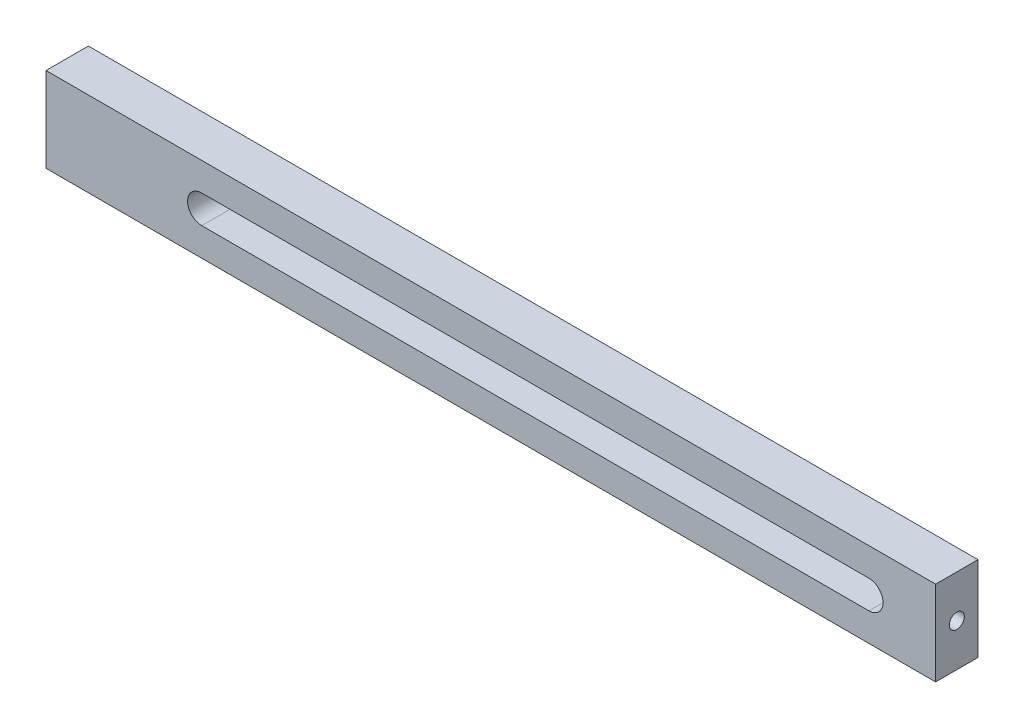
ISO-10303-21;
HEADER;
FILE_DESCRIPTION(('STEP AP214'),'2;1');
FILE_NAME('part.step','',(''),(''),'','','');
FILE_SCHEMA(('AUTOMOTIVE_DESIGN { 1 0 10303 214 1 1 1 1 }'));
ENDSEC;
DATA;
#1=APPLICATION_CONTEXT('core data for automotive mechanical design processes');
#2=APPLICATION_PROTOCOL_DEFINITION('international standard','automotive_design',2000,#1);
#3=PRODUCT_CONTEXT('',#1,'mechanical');
#4=PRODUCT('Part','Part','',(#3));
#5=PRODUCT_RELATED_PRODUCT_CATEGORY('part','',(#4));
#6=PRODUCT_DEFINITION_FORMATION('','',#4);
#7=PRODUCT_DEFINITION_CONTEXT('part definition',#1,'design');
#8=PRODUCT_DEFINITION('design','',#6,#7);
#9=PRODUCT_DEFINITION_SHAPE('','',#8);
#10=(LENGTH_UNIT() NAMED_UNIT(*) SI_UNIT(.MILLI.,.METRE.));
#11=(NAMED_UNIT(*) PLANE_ANGLE_UNIT() SI_UNIT($,.RADIAN.));
#12=(NAMED_UNIT(*) SI_UNIT($,.STERADIAN.) SOLID_ANGLE_UNIT());
#13=UNCERTAINTY_MEASURE_WITH_UNIT(LENGTH_MEASURE(1.E-05),#10,'distance_accuracy_value','');
#14=(GEOMETRIC_REPRESENTATION_CONTEXT(3) GLOBAL_UNCERTAINTY_ASSIGNED_CONTEXT((#13)) GLOBAL_UNIT_ASSIGNED_CONTEXT((#10,
#11,#12)) REPRESENTATION_CONTEXT('',''));
#15=CARTESIAN_POINT('',(0.,0.,0.));
#16=DIRECTION('',(0.,0.,1.));
#17=DIRECTION('',(1.,0.,0.));
#18=AXIS2_PLACEMENT_3D('',#15,#16,#17);
#19=CARTESIAN_POINT('',(0.,0.,9.525));
#20=DIRECTION('',(0.,0.,-1.));
#21=DIRECTION('',(-1.,0.,0.));
#22=AXIS2_PLACEMENT_3D('',#19,#20,#21);
#23=PLANE('',#22);
#24=DIRECTION('',(0.,1.,0.));
#25=VECTOR('',#24,1.);
#26=CARTESIAN_POINT('',(200.,-19.05,9.525));
#27=LINE('',#26,#25);
#28=CARTESIAN_POINT('',(200.,-19.05,9.525));
#29=VERTEX_POINT('',#28);
#30=CARTESIAN_POINT('',(200.,19.05,9.525));
#31=VERTEX_POINT('',#30);
#32=EDGE_CURVE('E205',#29,#31,#27,.T.);
#33=ORIENTED_EDGE('',*,*,#32,.T.);
#34=DIRECTION('',(-1.,0.,0.));
#35=VECTOR('',#34,1.);
#36=CARTESIAN_POINT('',(-200.,19.05,9.525));
#37=LINE('',#36,#35);
#38=CARTESIAN_POINT('',(-200.,19.05,9.525));
#39=VERTEX_POINT('',#38);
#40=EDGE_CURVE('E217',#31,#39,#37,.T.);
#41=ORIENTED_EDGE('',*,*,#40,.T.);
#42=DIRECTION('',(0.,-1.,0.));
#43=VECTOR('',#42,1.);
#44=CARTESIAN_POINT('',(-200.,-19.05,9.525));
#45=LINE('',#44,#43);
#46=CARTESIAN_POINT('',(-200.,-19.05,9.525));
#47=VERTEX_POINT('',#46);
#48=EDGE_CURVE('E199',#39,#47,#45,.T.);
#49=ORIENTED_EDGE('',*,*,#48,.T.);
#50=DIRECTION('',(1.,0.,0.));
#51=VECTOR('',#50,1.);
#52=CARTESIAN_POINT('',(-200.,-19.05,9.525));
#53=LINE('',#52,#51);
#54=EDGE_CURVE('E212',#47,#29,#53,.T.);
#55=ORIENTED_EDGE('',*,*,#54,.T.);
#56=EDGE_LOOP('',(#33,#41,#49,#55));
#57=FACE_BOUND('',#56,.T.);
#58=CARTESIAN_POINT('',(-130.,0.,9.525));
#59=DIRECTION('',(0.,0.,1.));
#60=DIRECTION('',(1.,0.,0.));
#61=AXIS2_PLACEMENT_3D('',#58,#59,#60);
#62=CIRCLE('',#61,6.35);
#63=CARTESIAN_POINT('',(-130.,6.35,9.525));
#64=VERTEX_POINT('',#63);
#65=CARTESIAN_POINT('',(-130.,-6.35,9.525));
#66=VERTEX_POINT('',#65);
#67=EDGE_CURVE('E135',#64,#66,#62,.T.);
#68=ORIENTED_EDGE('',*,*,#67,.F.);
#69=DIRECTION('',(-1.,0.,0.));
#70=VECTOR('',#69,1.);
#71=CARTESIAN_POINT('',(-130.,6.35,9.525));
#72=LINE('',#71,#70);
#73=CARTESIAN_POINT('',(170.,6.35,9.525));
#74=VERTEX_POINT('',#73);
#75=EDGE_CURVE('E231',#74,#64,#72,.T.);
#76=ORIENTED_EDGE('',*,*,#75,.F.);
#77=CARTESIAN_POINT('',(170.,0.,9.525));
#78=DIRECTION('',(0.,0.,1.));
#79=DIRECTION('',(1.,0.,0.));
#80=AXIS2_PLACEMENT_3D('',#77,#78,#79);
#81=CIRCLE('',#80,6.35);
#82=CARTESIAN_POINT('',(170.,-6.35,9.525));
#83=VERTEX_POINT('',#82);
#84=EDGE_CURVE('E243',#83,#74,#81,.T.);
#85=ORIENTED_EDGE('',*,*,#84,.F.);
#86=DIRECTION('',(1.,0.,0.));
#87=VECTOR('',#86,1.);
#88=CARTESIAN_POINT('',(-130.,-6.35,9.525));
#89=LINE('',#88,#87);
#90=EDGE_CURVE('E244',#66,#83,#89,.T.);
#91=ORIENTED_EDGE('',*,*,#90,.F.);
#92=EDGE_LOOP('',(#68,#76,#85,#91));
#93=FACE_BOUND('',#92,.T.);
#94=ADVANCED_FACE('F33',(#57,#93),#23,.F.);
#95=CARTESIAN_POINT('',(0.,0.,-9.525));
#96=DIRECTION('',(0.,0.,-1.));
#97=DIRECTION('',(-1.,0.,0.));
#98=AXIS2_PLACEMENT_3D('',#95,#96,#97);
#99=PLANE('',#98);
#100=DIRECTION('',(0.,1.,0.));
#101=VECTOR('',#100,1.);
#102=CARTESIAN_POINT('',(200.,-19.05,-9.525));
#103=LINE('',#102,#101);
#104=CARTESIAN_POINT('',(200.,-19.05,-9.525));
#105=VERTEX_POINT('',#104);
#106=CARTESIAN_POINT('',(200.,19.05,-9.525));
#107=VERTEX_POINT('',#106);
#108=EDGE_CURVE('E194',#105,#107,#103,.T.);
#109=ORIENTED_EDGE('',*,*,#108,.F.);
#110=DIRECTION('',(1.,0.,0.));
#111=VECTOR('',#110,1.);
#112=CARTESIAN_POINT('',(-200.,-19.05,-9.525));
#113=LINE('',#112,#111);
#114=CARTESIAN_POINT('',(-200.,-19.05,-9.525));
#115=VERTEX_POINT('',#114);
#116=EDGE_CURVE('E203',#115,#105,#113,.T.);
#117=ORIENTED_EDGE('',*,*,#116,.F.);
#118=DIRECTION('',(0.,-1.,0.));
#119=VECTOR('',#118,1.);
#120=CARTESIAN_POINT('',(-200.,-19.05,-9.525));
#121=LINE('',#120,#119);
#122=CARTESIAN_POINT('',(-200.,19.05,-9.525));
#123=VERTEX_POINT('',#122);
#124=EDGE_CURVE('E193',#123,#115,#121,.T.);
#125=ORIENTED_EDGE('',*,*,#124,.F.);
#126=DIRECTION('',(-1.,0.,0.));
#127=VECTOR('',#126,1.);
#128=CARTESIAN_POINT('',(-200.,19.05,-9.525));
#129=LINE('',#128,#127);
#130=EDGE_CURVE('E186',#107,#123,#129,.T.);
#131=ORIENTED_EDGE('',*,*,#130,.F.);
#132=EDGE_LOOP('',(#109,#117,#125,#131));
#133=FACE_BOUND('',#132,.T.);
#134=DIRECTION('',(-1.,0.,0.));
#135=VECTOR('',#134,1.);
#136=CARTESIAN_POINT('',(-130.,6.35,-9.525));
#137=LINE('',#136,#135);
#138=CARTESIAN_POINT('',(170.,6.35,-9.525));
#139=VERTEX_POINT('',#138);
#140=CARTESIAN_POINT('',(-130.,6.35,-9.525));
#141=VERTEX_POINT('',#140);
#142=EDGE_CURVE('E232',#139,#141,#137,.T.);
#143=ORIENTED_EDGE('',*,*,#142,.T.);
#144=CARTESIAN_POINT('',(-130.,0.,-9.525));
#145=DIRECTION('',(0.,0.,1.));
#146=DIRECTION('',(1.,0.,0.));
#147=AXIS2_PLACEMENT_3D('',#144,#145,#146);
#148=CIRCLE('',#147,6.35);
#149=CARTESIAN_POINT('',(-130.,-6.35,-9.525));
#150=VERTEX_POINT('',#149);
#151=EDGE_CURVE('E56',#141,#150,#148,.T.);
#152=ORIENTED_EDGE('',*,*,#151,.T.);
#153=DIRECTION('',(1.,0.,0.));
#154=VECTOR('',#153,1.);
#155=CARTESIAN_POINT('',(-130.,-6.35,-9.525));
#156=LINE('',#155,#154);
#157=CARTESIAN_POINT('',(170.,-6.35,-9.525));
#158=VERTEX_POINT('',#157);
#159=EDGE_CURVE('E238',#150,#158,#156,.T.);
#160=ORIENTED_EDGE('',*,*,#159,.T.);
#161=CARTESIAN_POINT('',(170.,0.,-9.525));
#162=DIRECTION('',(0.,0.,1.));
#163=DIRECTION('',(1.,0.,0.));
#164=AXIS2_PLACEMENT_3D('',#161,#162,#163);
#165=CIRCLE('',#164,6.35);
#166=EDGE_CURVE('E235',#158,#139,#165,.T.);
#167=ORIENTED_EDGE('',*,*,#166,.T.);
#168=EDGE_LOOP('',(#143,#152,#160,#167));
#169=FACE_BOUND('',#168,.T.);
#170=ADVANCED_FACE('F157',(#133,#169),#99,.T.);
#171=CARTESIAN_POINT('',(200.,-19.05,9.525));
#172=DIRECTION('',(-1.,0.,0.));
#173=DIRECTION('',(0.,0.,1.));
#174=AXIS2_PLACEMENT_3D('',#171,#172,#173);
#175=PLANE('',#174);
#176=CARTESIAN_POINT('',(200.,0.,0.));
#177=DIRECTION('',(1.,0.,0.));
#178=DIRECTION('',(0.,0.,-1.));
#179=AXIS2_PLACEMENT_3D('',#176,#177,#178);
#180=CIRCLE('',#179,3.37819999999999);
#181=CARTESIAN_POINT('',(200.,0.,-3.37819999999999));
#182=VERTEX_POINT('',#181);
#183=EDGE_CURVE('E125',#182,#182,#180,.T.);
#184=ORIENTED_EDGE('',*,*,#183,.F.);
#185=EDGE_LOOP('',(#184));
#186=FACE_BOUND('',#185,.T.);
#187=ORIENTED_EDGE('',*,*,#108,.T.);
#188=DIRECTION('',(0.,0.,-1.));
#189=VECTOR('',#188,1.);
#190=CARTESIAN_POINT('',(200.,19.05,9.525));
#191=LINE('',#190,#189);
#192=EDGE_CURVE('E11',#31,#107,#191,.T.);
#193=ORIENTED_EDGE('',*,*,#192,.F.);
#194=ORIENTED_EDGE('',*,*,#32,.F.);
#195=DIRECTION('',(0.,0.,-1.));
#196=VECTOR('',#195,1.);
#197=CARTESIAN_POINT('',(200.,-19.05,9.525));
#198=LINE('',#197,#196);
#199=EDGE_CURVE('E209',#29,#105,#198,.T.);
#200=ORIENTED_EDGE('',*,*,#199,.T.);
#201=EDGE_LOOP('',(#187,#193,#194,#200));
#202=FACE_BOUND('',#201,.T.);
#203=ADVANCED_FACE('F35',(#186,#202),#175,.F.);
#204=CARTESIAN_POINT('',(-200.,19.05,9.525));
#205=DIRECTION('',(0.,-1.,0.));
#206=DIRECTION('',(0.,0.,-1.));
#207=AXIS2_PLACEMENT_3D('',#204,#205,#206);
#208=PLANE('',#207);
#209=ORIENTED_EDGE('',*,*,#130,.T.);
#210=DIRECTION('',(0.,0.,-1.));
#211=VECTOR('',#210,1.);
#212=CARTESIAN_POINT('',(-200.,19.05,9.525));
#213=LINE('',#212,#211);
#214=EDGE_CURVE('E41',#39,#123,#213,.T.);
#215=ORIENTED_EDGE('',*,*,#214,.F.);
#216=ORIENTED_EDGE('',*,*,#40,.F.);
#217=ORIENTED_EDGE('',*,*,#192,.T.);
#218=EDGE_LOOP('',(#209,#215,#216,#217));
#219=FACE_BOUND('',#218,.T.);
#220=ADVANCED_FACE('F177',(#219),#208,.F.);
#221=CARTESIAN_POINT('',(-200.,-19.05,9.525));
#222=DIRECTION('',(1.,0.,0.));
#223=DIRECTION('',(0.,0.,-1.));
#224=AXIS2_PLACEMENT_3D('',#221,#222,#223);
#225=PLANE('',#224);
#226=CARTESIAN_POINT('',(-200.,9.,0.));
#227=DIRECTION('',(-1.,0.,0.));
#228=DIRECTION('',(0.,0.,1.));
#229=AXIS2_PLACEMENT_3D('',#226,#227,#228);
#230=CIRCLE('',#229,4.6736);
#231=CARTESIAN_POINT('',(-200.,9.,4.67359999999999));
#232=VERTEX_POINT('',#231);
#233=EDGE_CURVE('E115',#232,#232,#230,.T.);
#234=ORIENTED_EDGE('',*,*,#233,.F.);
#235=EDGE_LOOP('',(#234));
#236=FACE_BOUND('',#235,.T.);
#237=CARTESIAN_POINT('',(-200.,-9.,0.));
#238=DIRECTION('',(-1.,0.,0.));
#239=DIRECTION('',(0.,0.,1.));
#240=AXIS2_PLACEMENT_3D('',#237,#238,#239);
#241=CIRCLE('',#240,4.6736);
#242=CARTESIAN_POINT('',(-200.,-9.,4.6736));
#243=VERTEX_POINT('',#242);
#244=EDGE_CURVE('E114',#243,#243,#241,.T.);
#245=ORIENTED_EDGE('',*,*,#244,.F.);
#246=EDGE_LOOP('',(#245));
#247=FACE_BOUND('',#246,.T.);
#248=ORIENTED_EDGE('',*,*,#124,.T.);
#249=DIRECTION('',(0.,0.,-1.));
#250=VECTOR('',#249,1.);
#251=CARTESIAN_POINT('',(-200.,-19.05,9.525));
#252=LINE('',#251,#250);
#253=EDGE_CURVE('E200',#47,#115,#252,.T.);
#254=ORIENTED_EDGE('',*,*,#253,.F.);
#255=ORIENTED_EDGE('',*,*,#48,.F.);
#256=ORIENTED_EDGE('',*,*,#214,.T.);
#257=EDGE_LOOP('',(#248,#254,#255,#256));
#258=FACE_BOUND('',#257,.T.);
#259=ADVANCED_FACE('F174',(#236,#247,#258),#225,.F.);
#260=CARTESIAN_POINT('',(-200.,-19.05,9.525));
#261=DIRECTION('',(0.,1.,0.));
#262=DIRECTION('',(0.,0.,1.));
#263=AXIS2_PLACEMENT_3D('',#260,#261,#262);
#264=PLANE('',#263);
#265=ORIENTED_EDGE('',*,*,#116,.T.);
#266=ORIENTED_EDGE('',*,*,#199,.F.);
#267=ORIENTED_EDGE('',*,*,#54,.F.);
#268=ORIENTED_EDGE('',*,*,#253,.T.);
#269=EDGE_LOOP('',(#265,#266,#267,#268));
#270=FACE_BOUND('',#269,.T.);
#271=ADVANCED_FACE('F171',(#270),#264,.F.);
#272=CARTESIAN_POINT('',(-130.,0.,9.525));
#273=DIRECTION('',(0.,0.,-1.));
#274=DIRECTION('',(-1.,0.,0.));
#275=AXIS2_PLACEMENT_3D('',#272,#273,#274);
#276=CYLINDRICAL_SURFACE('',#275,6.35);
#277=ORIENTED_EDGE('',*,*,#151,.F.);
#278=DIRECTION('',(0.,0.,-1.));
#279=VECTOR('',#278,1.);
#280=CARTESIAN_POINT('',(-130.,6.35,9.525));
#281=LINE('',#280,#279);
#282=EDGE_CURVE('E229',#64,#141,#281,.T.);
#283=ORIENTED_EDGE('',*,*,#282,.F.);
#284=ORIENTED_EDGE('',*,*,#67,.T.);
#285=DIRECTION('',(0.,0.,-1.));
#286=VECTOR('',#285,1.);
#287=CARTESIAN_POINT('',(-130.,-6.35,9.525));
#288=LINE('',#287,#286);
#289=EDGE_CURVE('E220',#66,#150,#288,.T.);
#290=ORIENTED_EDGE('',*,*,#289,.T.);
#291=EDGE_LOOP('',(#277,#283,#284,#290));
#292=FACE_BOUND('',#291,.T.);
#293=ADVANCED_FACE('F168',(#292),#276,.F.);
#294=CARTESIAN_POINT('',(-130.,-6.35,9.525));
#295=DIRECTION('',(0.,1.,0.));
#296=DIRECTION('',(0.,0.,1.));
#297=AXIS2_PLACEMENT_3D('',#294,#295,#296);
#298=PLANE('',#297);
#299=ORIENTED_EDGE('',*,*,#159,.F.);
#300=ORIENTED_EDGE('',*,*,#289,.F.);
#301=ORIENTED_EDGE('',*,*,#90,.T.);
#302=DIRECTION('',(0.,0.,-1.));
#303=VECTOR('',#302,1.);
#304=CARTESIAN_POINT('',(170.,-6.35,9.525));
#305=LINE('',#304,#303);
#306=EDGE_CURVE('E222',#83,#158,#305,.T.);
#307=ORIENTED_EDGE('',*,*,#306,.T.);
#308=EDGE_LOOP('',(#299,#300,#301,#307));
#309=FACE_BOUND('',#308,.T.);
#310=ADVANCED_FACE('F250',(#309),#298,.T.);
#311=CARTESIAN_POINT('',(170.,0.,9.525));
#312=DIRECTION('',(0.,0.,-1.));
#313=DIRECTION('',(-1.,0.,0.));
#314=AXIS2_PLACEMENT_3D('',#311,#312,#313);
#315=CYLINDRICAL_SURFACE('',#314,6.35);
#316=CARTESIAN_POINT('',(176.35,0.,-3.37819999999999));
#317=CARTESIAN_POINT('',(176.350000268752,-0.0881409935486976,-3.37820030569019));
#318=CARTESIAN_POINT('',(176.348160864951,-0.176277726646788,-3.37474676470784));
#319=CARTESIAN_POINT('',(176.340851580717,-0.35189190049562,-3.36097723544444));
#320=CARTESIAN_POINT('',(176.335380438779,-0.439369101472113,-3.35065886262202));
#321=CARTESIAN_POINT('',(176.320937022298,-0.613070134048545,-3.32326896308826));
#322=CARTESIAN_POINT('',(176.31196079396,-0.699292435769109,-3.3061898098056));
#323=CARTESIAN_POINT('',(176.290737876765,-0.869779337667914,-3.26548841882818));
#324=CARTESIAN_POINT('',(176.278489851661,-0.954043122641614,-3.24186350760734));
#325=CARTESIAN_POINT('',(176.237382801463,-1.20228998788664,-3.16177341619728));
#326=CARTESIAN_POINT('',(176.204081128044,-1.36263159001621,-3.09594740982332));
#327=CARTESIAN_POINT('',(176.128617927147,-1.66961741297086,-2.94180108975038));
#328=CARTESIAN_POINT('',(176.086456387582,-1.81626161510759,-2.85348074536134));
#329=CARTESIAN_POINT('',(175.993777169701,-2.10267269849522,-2.6502468070491));
#330=CARTESIAN_POINT('',(175.942891995512,-2.24135020984127,-2.53396467225996));
#331=CARTESIAN_POINT('',(175.83956424294,-2.49824102506125,-2.28113823545038));
#332=CARTESIAN_POINT('',(175.78712035416,-2.61643650510133,-2.14457647570395));
#333=CARTESIAN_POINT('',(175.681043743829,-2.83987417749724,-1.84012771762514));
#334=CARTESIAN_POINT('',(175.627734092754,-2.94297136917017,-1.67052336323246));
#335=CARTESIAN_POINT('',(175.556157989714,-3.07475516979025,-1.40286776318434));
#336=CARTESIAN_POINT('',(175.533691364728,-3.11488217119898,-1.31140890611389));
#337=CARTESIAN_POINT('',(175.492421367476,-3.18708879207072,-1.1245925224494));
#338=CARTESIAN_POINT('',(175.47361570416,-3.21917344811583,-1.02923747961303));
#339=CARTESIAN_POINT('',(175.441512032929,-3.27312892868197,-0.841321079239696));
#340=CARTESIAN_POINT('',(175.427945338955,-3.29550869652528,-0.748951641035136));
#341=CARTESIAN_POINT('',(175.405340393541,-3.33245631888178,-0.562162663570476));
#342=CARTESIAN_POINT('',(175.396299576569,-3.34702859946696,-0.467744317496064));
#343=CARTESIAN_POINT('',(175.383162536277,-3.3681182008534,-0.277738362085118));
#344=CARTESIAN_POINT('',(175.379062300138,-3.37464205881563,-0.182151765456012));
#345=CARTESIAN_POINT('',(175.37598042156,-3.37954598024581,0.00927929973000784));
#346=CARTESIAN_POINT('',(175.376998164777,-3.3779270211503,0.105123735956355));
#347=CARTESIAN_POINT('',(175.386707832279,-3.36245286973242,0.364858610237814));
#348=CARTESIAN_POINT('',(175.400387050857,-3.34064363773452,0.528174641648056));
#349=CARTESIAN_POINT('',(175.440995459155,-3.27406914693114,0.848239467593796));
#350=CARTESIAN_POINT('',(175.46792992748,-3.22929474246209,1.00498561881461));
#351=CARTESIAN_POINT('',(175.532506179959,-3.11738994716874,1.31202706342921));
#352=CARTESIAN_POINT('',(175.570375458213,-3.0497787529571,1.46209755380518));
#353=CARTESIAN_POINT('',(175.652615537483,-2.8945019520142,1.74951697586815));
#354=CARTESIAN_POINT('',(175.696989220651,-2.80682744536406,1.88686022375567));
#355=CARTESIAN_POINT('',(175.795040431867,-2.59904875289423,2.16604091207246));
#356=CARTESIAN_POINT('',(175.849130115789,-2.47607807699562,2.30560362282164));
#357=CARTESIAN_POINT('',(175.955372668168,-2.20833373245617,2.56319776121747));
#358=CARTESIAN_POINT('',(176.007524350665,-2.06354697870771,2.6812161721738));
#359=CARTESIAN_POINT('',(176.081920452073,-1.82760108200296,2.84287603215937));
#360=CARTESIAN_POINT('',(176.106703854465,-1.74320794460645,2.89540988709109));
#361=CARTESIAN_POINT('',(176.153619086531,-1.56956753789137,2.99309243295851));
#362=CARTESIAN_POINT('',(176.175752120055,-1.48032249939265,3.03824448028883));
#363=CARTESIAN_POINT('',(176.216719384067,-1.29756339315658,3.12067514352955));
#364=CARTESIAN_POINT('',(176.235554340947,-1.20405027118717,3.15795549353293));
#365=CARTESIAN_POINT('',(176.269346192385,-1.01348499603524,3.22416627802563));
#366=CARTESIAN_POINT('',(176.28430540924,-0.916435002057997,3.25310171386965));
#367=CARTESIAN_POINT('',(176.308735806862,-0.728372234815065,3.30003736112787));
#368=CARTESIAN_POINT('',(176.318577501275,-0.637593157045098,3.31878277785791));
#369=CARTESIAN_POINT('',(176.33437885195,-0.45451284787765,3.34876890446175));
#370=CARTESIAN_POINT('',(176.340340464843,-0.362212407781295,3.36001339693922));
#371=CARTESIAN_POINT('',(176.348214175066,-0.176843394009391,3.3748481314422));
#372=CARTESIAN_POINT('',(176.35012731776,-0.0837750248549649,3.37844034937945));
#373=CARTESIAN_POINT('',(176.349859162229,0.102306232089627,3.37793423709071));
#374=CARTESIAN_POINT('',(176.347678095614,0.195319122720473,3.37383634189603));
#375=CARTESIAN_POINT('',(176.335814056989,0.456345536025672,3.35148794878929));
#376=CARTESIAN_POINT('',(176.321454928945,0.623491998668636,3.32440451265723));
#377=CARTESIAN_POINT('',(176.28064728109,0.950363111819464,3.24612979334538));
#378=CARTESIAN_POINT('',(176.254197500776,1.11008698657751,3.1949359965402));
#379=CARTESIAN_POINT('',(176.190732229001,1.42244916142537,3.06886626002056));
#380=CARTESIAN_POINT('',(176.153468071751,1.57480877326046,2.99342785387278));
#381=CARTESIAN_POINT('',(176.071782250993,1.86514102046359,2.82169780345769));
#382=CARTESIAN_POINT('',(176.027357783213,2.00310798406653,2.72539798390239));
#383=CARTESIAN_POINT('',(175.929864203263,2.27650161650229,2.50281415989244));
#384=CARTESIAN_POINT('',(175.876379010799,2.41006659792779,2.37442138886742));
#385=CARTESIAN_POINT('',(175.769999560285,2.65470054735084,2.097387512686));
#386=CARTESIAN_POINT('',(175.717105885685,2.76574888687524,1.94872804694365));
#387=CARTESIAN_POINT('',(175.614180375514,2.96940665819096,1.62297600611885));
#388=CARTESIAN_POINT('',(175.564572906913,3.06029833048312,1.4446499111854));
#389=CARTESIAN_POINT('',(175.500903545714,3.1724446343417,1.16530341155343));
#390=CARTESIAN_POINT('',(175.481469851086,3.20579620004167,1.0702053544002));
#391=CARTESIAN_POINT('',(175.447001536656,3.2640193406277,0.876696764003814));
#392=CARTESIAN_POINT('',(175.43196394022,3.28889665539067,0.778288522690498));
#393=CARTESIAN_POINT('',(175.408225560753,3.32777146981389,0.588730521749008));
#394=CARTESIAN_POINT('',(175.399049963733,3.3425931301364,0.497808293649596));
#395=CARTESIAN_POINT('',(175.385259040217,3.36476695517867,0.31475656580545));
#396=CARTESIAN_POINT('',(175.380641239634,3.37212317238991,0.222627748579722));
#397=CARTESIAN_POINT('',(175.376169571722,3.37924862649575,0.0379865196142977));
#398=CARTESIAN_POINT('',(175.376314112859,3.37902039804726,-0.0545257536435807));
#399=CARTESIAN_POINT('',(175.381346104163,3.37099787325588,-0.239062896292002));
#400=CARTESIAN_POINT('',(175.386233247441,3.36320406647491,-0.331087796832596));
#401=CARTESIAN_POINT('',(175.405995017044,3.33141813006953,-0.583125636931354));
#402=CARTESIAN_POINT('',(175.425629960613,3.29962948271791,-0.74186067651111));
#403=CARTESIAN_POINT('',(175.476510542719,3.21445774465751,-1.05135113802576));
#404=CARTESIAN_POINT('',(175.507760455732,3.16106670331652,-1.20210359889379));
#405=CARTESIAN_POINT('',(175.580755663918,3.03044605335977,-1.50237694846503));
#406=CARTESIAN_POINT('',(175.623048674294,2.95189895631118,-1.65118876444733));
#407=CARTESIAN_POINT('',(175.71266088034,2.77450383085756,-1.9345122985606));
#408=CARTESIAN_POINT('',(175.759982776172,2.67564486953964,-2.06901625602756));
#409=CARTESIAN_POINT('',(175.862441551641,2.44388051262734,-2.34006236435023));
#410=CARTESIAN_POINT('',(175.917724316872,2.30812410481264,-2.47412028607336));
#411=CARTESIAN_POINT('',(176.023915081224,2.01475091034197,-2.71834468651044));
#412=CARTESIAN_POINT('',(176.074820258378,1.85712019121964,-2.82849582264268));
#413=CARTESIAN_POINT('',(176.144474798219,1.60493954053682,-2.97425016485663));
#414=CARTESIAN_POINT('',(176.166800281287,1.51710952939859,-3.02001379881548));
#415=CARTESIAN_POINT('',(176.208299615175,1.33716841298163,-3.10387699067198));
#416=CARTESIAN_POINT('',(176.227475016553,1.24505944273936,-3.14198032126135));
#417=CARTESIAN_POINT('',(176.26206770084,1.05740070537387,-3.20999718630555));
#418=CARTESIAN_POINT('',(176.277492565535,0.961858335636121,-3.23992725850912));
#419=CARTESIAN_POINT('',(176.304146194073,0.767987360223308,-3.29127284834679));
#420=CARTESIAN_POINT('',(176.315377294155,0.669660338752283,-3.31269310700901));
#421=CARTESIAN_POINT('',(176.332801002671,0.476469973227234,-3.34578689247549));
#422=CARTESIAN_POINT('',(176.339233770945,0.381707872543104,-3.35792589639694));
#423=CARTESIAN_POINT('',(176.347833152349,0.191295516888976,-3.37413233832859));
#424=CARTESIAN_POINT('',(176.349999708367,0.0956452500463515,-3.37819966828357));
#425=CARTESIAN_POINT('',(176.35,0.,-3.37819999999999));
#426=B_SPLINE_CURVE_WITH_KNOTS('',3,(#316,#317,#318,#319,#320,#321,#322,#323,#324,#325,#326,
#327,#328,#329,#330,#331,#332,#333,#334,#335,#336,#337,#338,#339,#340,#341,#342,#343,#344,#345,
#346,#347,#348,#349,#350,#351,#352,#353,#354,#355,#356,#357,#358,#359,#360,#361,#362,#363,#364,
#365,#366,#367,#368,#369,#370,#371,#372,#373,#374,#375,#376,#377,#378,#379,#380,#381,#382,#383,
#384,#385,#386,#387,#388,#389,#390,#391,#392,#393,#394,#395,#396,#397,#398,#399,#400,#401,#402,
#403,#404,#405,#406,#407,#408,#409,#410,#411,#412,#413,#414,#415,#416,#417,#418,#419,#420,#421,
#422,#423,#424,#425),.UNSPECIFIED.,.T.,.F.,(4,2,2,2,2,2,2,2,2,2,2,2,2,2,2,2,2,2,2,2,2,2,2,2,2,2,
2,2,2,2,2,2,2,2,2,2,2,2,2,2,2,2,2,2,2,2,2,2,2,2,2,2,2,2,4),(0.,0.264328877789343,
0.528749619803973,0.793469498417881,1.05829765806771,1.5852346845539,2.11217242996819,
2.67382142668005,3.23595675250712,3.8490418457721,4.15578550361226,4.46233657815347,
4.74992966740922,5.03735954689512,5.32455581351192,5.61171760687169,6.10514954797797,
6.59877814645539,7.10352456988227,7.6084953301509,8.18723821968633,8.7663296265882,
9.07333524323341,9.38020087856005,9.68699884233052,9.99361254903601,10.2728756681802,
10.5519978524427,10.8310479551708,11.1100822724521,11.617295838653,12.1245622961084,
12.644568283967,13.1647784245351,13.7408177940612,14.3173825372557,14.9322973188204,
15.2397932513181,15.5470804910659,15.8244139186254,16.1015967196958,16.3786868895753,
16.6557591303886,17.1426141551426,17.6296485272122,18.1481547026387,18.6669406999235,
19.2602713216272,19.8539816046074,20.1581934069678,20.4622550162957,20.7656967511102,
21.0689691931358,21.3557989888187,21.642632624256),.UNSPECIFIED.);
#427=CARTESIAN_POINT('',(176.35,0.,-3.37819999999999));
#428=VERTEX_POINT('',#427);
#429=EDGE_CURVE('E128',#428,#428,#426,.T.);
#430=ORIENTED_EDGE('',*,*,#429,.F.);
#431=EDGE_LOOP('',(#430));
#432=FACE_BOUND('',#431,.T.);
#433=ORIENTED_EDGE('',*,*,#166,.F.);
#434=ORIENTED_EDGE('',*,*,#306,.F.);
#435=ORIENTED_EDGE('',*,*,#84,.T.);
#436=DIRECTION('',(0.,0.,-1.));
#437=VECTOR('',#436,1.);
#438=CARTESIAN_POINT('',(170.,6.35,9.525));
#439=LINE('',#438,#437);
#440=EDGE_CURVE('E48',#74,#139,#439,.T.);
#441=ORIENTED_EDGE('',*,*,#440,.T.);
#442=EDGE_LOOP('',(#433,#434,#435,#441));
#443=FACE_BOUND('',#442,.T.);
#444=ADVANCED_FACE('F254',(#432,#443),#315,.F.);
#445=CARTESIAN_POINT('',(-130.,6.35,9.525));
#446=DIRECTION('',(0.,-1.,0.));
#447=DIRECTION('',(0.,0.,-1.));
#448=AXIS2_PLACEMENT_3D('',#445,#446,#447);
#449=PLANE('',#448);
#450=ORIENTED_EDGE('',*,*,#142,.F.);
#451=ORIENTED_EDGE('',*,*,#440,.F.);
#452=ORIENTED_EDGE('',*,*,#75,.T.);
#453=ORIENTED_EDGE('',*,*,#282,.T.);
#454=EDGE_LOOP('',(#450,#451,#452,#453));
#455=FACE_BOUND('',#454,.T.);
#456=ADVANCED_FACE('F144',(#455),#449,.T.);
#457=CARTESIAN_POINT('',(200.,0.,0.));
#458=DIRECTION('',(1.,0.,0.));
#459=DIRECTION('',(0.,0.,-1.));
#460=AXIS2_PLACEMENT_3D('',#457,#458,#459);
#461=CYLINDRICAL_SURFACE('',#460,3.37819999999999);
#462=ORIENTED_EDGE('',*,*,#183,.T.);
#463=EDGE_LOOP('',(#462));
#464=FACE_BOUND('',#463,.T.);
#465=ORIENTED_EDGE('',*,*,#429,.T.);
#466=EDGE_LOOP('',(#465));
#467=FACE_BOUND('',#466,.T.);
#468=ADVANCED_FACE('F139',(#464,#467),#461,.F.);
#469=CARTESIAN_POINT('',(-180.,-9.,0.));
#470=DIRECTION('',(-1.,0.,0.));
#471=DIRECTION('',(0.,0.,1.));
#472=AXIS2_PLACEMENT_3D('',#469,#470,#471);
#473=CONICAL_SURFACE('',#472,4.6736,1.02974425867665);
#474=CARTESIAN_POINT('',(-177.191817810913,-9.00000000000001,0.));
#475=VERTEX_POINT('',#474);
#476=VERTEX_LOOP('',#475);
#477=FACE_BOUND('',#476,.T.);
#478=CARTESIAN_POINT('',(-180.,-9.,0.));
#479=DIRECTION('',(-1.,0.,0.));
#480=DIRECTION('',(0.,0.,1.));
#481=AXIS2_PLACEMENT_3D('',#478,#479,#480);
#482=CIRCLE('',#481,4.6736);
#483=CARTESIAN_POINT('',(-180.,-9.,4.6736));
#484=VERTEX_POINT('',#483);
#485=EDGE_CURVE('E118',#484,#484,#482,.T.);
#486=ORIENTED_EDGE('',*,*,#485,.T.);
#487=EDGE_LOOP('',(#486));
#488=FACE_BOUND('',#487,.T.);
#489=ADVANCED_FACE('F143',(#477,#488),#473,.F.);
#490=CARTESIAN_POINT('',(-200.,-9.,0.));
#491=DIRECTION('',(-1.,0.,0.));
#492=DIRECTION('',(0.,0.,1.));
#493=AXIS2_PLACEMENT_3D('',#490,#491,#492);
#494=CYLINDRICAL_SURFACE('',#493,4.6736);
#495=ORIENTED_EDGE('',*,*,#485,.F.);
#496=EDGE_LOOP('',(#495));
#497=FACE_BOUND('',#496,.T.);
#498=ORIENTED_EDGE('',*,*,#244,.T.);
#499=EDGE_LOOP('',(#498));
#500=FACE_BOUND('',#499,.T.);
#501=ADVANCED_FACE('F108',(#497,#500),#494,.F.);
#502=CARTESIAN_POINT('',(-180.,9.,0.));
#503=DIRECTION('',(-1.,0.,0.));
#504=DIRECTION('',(0.,0.,1.));
#505=AXIS2_PLACEMENT_3D('',#502,#503,#504);
#506=CONICAL_SURFACE('',#505,4.6736,1.02974425867665);
#507=CARTESIAN_POINT('',(-177.191817810913,8.99999999999999,0.));
#508=VERTEX_POINT('',#507);
#509=VERTEX_LOOP('',#508);
#510=FACE_BOUND('',#509,.T.);
#511=CARTESIAN_POINT('',(-180.,9.,0.));
#512=DIRECTION('',(-1.,0.,0.));
#513=DIRECTION('',(0.,0.,1.));
#514=AXIS2_PLACEMENT_3D('',#511,#512,#513);
#515=CIRCLE('',#514,4.6736);
#516=CARTESIAN_POINT('',(-180.,9.,4.67359999999999));
#517=VERTEX_POINT('',#516);
#518=EDGE_CURVE('E112',#517,#517,#515,.T.);
#519=ORIENTED_EDGE('',*,*,#518,.T.);
#520=EDGE_LOOP('',(#519));
#521=FACE_BOUND('',#520,.T.);
#522=ADVANCED_FACE('F104',(#510,#521),#506,.F.);
#523=CARTESIAN_POINT('',(-200.,9.,0.));
#524=DIRECTION('',(-1.,0.,0.));
#525=DIRECTION('',(0.,0.,1.));
#526=AXIS2_PLACEMENT_3D('',#523,#524,#525);
#527=CYLINDRICAL_SURFACE('',#526,4.6736);
#528=ORIENTED_EDGE('',*,*,#518,.F.);
#529=EDGE_LOOP('',(#528));
#530=FACE_BOUND('',#529,.T.);
#531=ORIENTED_EDGE('',*,*,#233,.T.);
#532=EDGE_LOOP('',(#531));
#533=FACE_BOUND('',#532,.T.);
#534=ADVANCED_FACE('F107',(#530,#533),#527,.F.);
#535=CLOSED_SHELL('',(#94,#170,#203,#220,#259,#271,#293,#310,#444,#456,#468,#489,#501,#522,#534));
#536=MANIFOLD_SOLID_BREP('B2',#535);
#537=ADVANCED_BREP_SHAPE_REPRESENTATION('',(#18,#536),#14);
#538=SHAPE_DEFINITION_REPRESENTATION(#9,#537);
ENDSEC;
END-ISO-10303-21;
